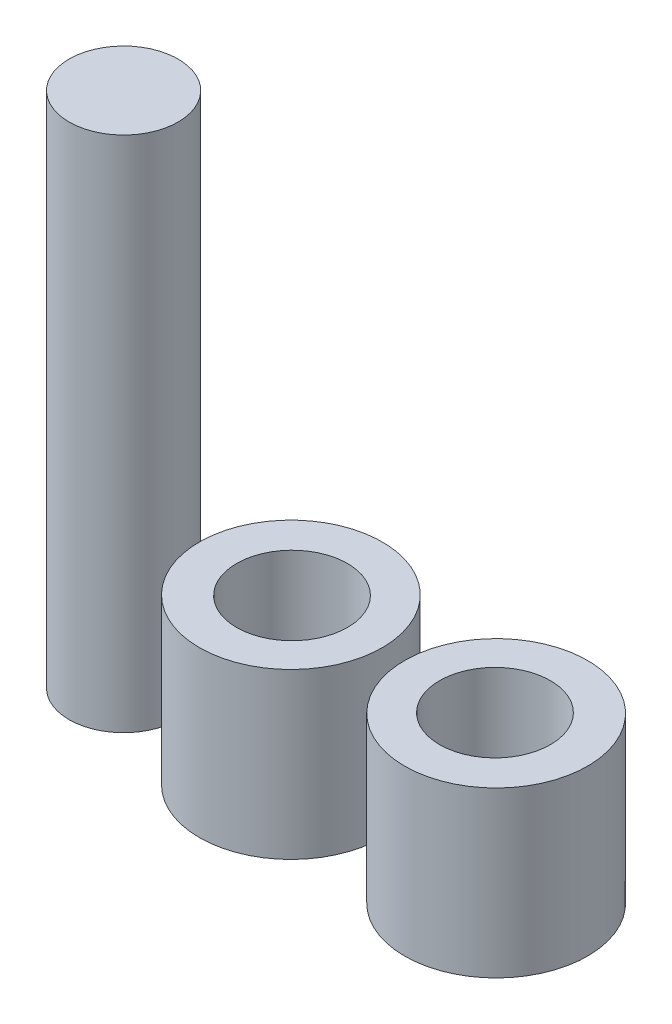
ISO-10303-21;
HEADER;
FILE_DESCRIPTION(('STEP AP214'),'2;1');
FILE_NAME('part.step','',(''),(''),'','','');
FILE_SCHEMA(('AUTOMOTIVE_DESIGN { 1 0 10303 214 1 1 1 1 }'));
ENDSEC;
DATA;
#1=APPLICATION_CONTEXT('core data for automotive mechanical design processes');
#2=APPLICATION_PROTOCOL_DEFINITION('international standard','automotive_design',2000,#1);
#3=PRODUCT_CONTEXT('',#1,'mechanical');
#4=PRODUCT('Part','Part','',(#3));
#5=PRODUCT_RELATED_PRODUCT_CATEGORY('part','',(#4));
#6=PRODUCT_DEFINITION_FORMATION('','',#4);
#7=PRODUCT_DEFINITION_CONTEXT('part definition',#1,'design');
#8=PRODUCT_DEFINITION('design','',#6,#7);
#9=PRODUCT_DEFINITION_SHAPE('','',#8);
#10=(LENGTH_UNIT() NAMED_UNIT(*) SI_UNIT(.MILLI.,.METRE.));
#11=(NAMED_UNIT(*) PLANE_ANGLE_UNIT() SI_UNIT($,.RADIAN.));
#12=(NAMED_UNIT(*) SI_UNIT($,.STERADIAN.) SOLID_ANGLE_UNIT());
#13=UNCERTAINTY_MEASURE_WITH_UNIT(LENGTH_MEASURE(1.E-05),#10,'distance_accuracy_value','');
#14=(GEOMETRIC_REPRESENTATION_CONTEXT(3) GLOBAL_UNCERTAINTY_ASSIGNED_CONTEXT((#13)) GLOBAL_UNIT_ASSIGNED_CONTEXT((#10,
#11,#12)) REPRESENTATION_CONTEXT('',''));
#15=CARTESIAN_POINT('',(0.,0.,0.));
#16=DIRECTION('',(0.,0.,1.));
#17=DIRECTION('',(1.,0.,0.));
#18=AXIS2_PLACEMENT_3D('',#15,#16,#17);
#19=CARTESIAN_POINT('',(10.0759038740106,4.45,0.));
#20=DIRECTION('',(0.,-1.,0.));
#21=DIRECTION('',(0.,0.,-1.));
#22=AXIS2_PLACEMENT_3D('',#19,#20,#21);
#23=CYLINDRICAL_SURFACE('',#22,2.475);
#24=CARTESIAN_POINT('',(10.0759038740106,4.45,0.));
#25=DIRECTION('',(0.,-1.,0.));
#26=DIRECTION('',(0.,0.,1.));
#27=AXIS2_PLACEMENT_3D('',#24,#25,#26);
#28=CIRCLE('',#27,2.475);
#29=CARTESIAN_POINT('',(10.0759038740106,4.45,2.475));
#30=VERTEX_POINT('',#29);
#31=EDGE_CURVE('E11',#30,#30,#28,.T.);
#32=ORIENTED_EDGE('',*,*,#31,.T.);
#33=EDGE_LOOP('',(#32));
#34=FACE_BOUND('',#33,.T.);
#35=CARTESIAN_POINT('',(10.0759038740106,0.,0.));
#36=DIRECTION('',(0.,-1.,0.));
#37=DIRECTION('',(0.,0.,1.));
#38=AXIS2_PLACEMENT_3D('',#35,#36,#37);
#39=CIRCLE('',#38,2.475);
#40=CARTESIAN_POINT('',(10.0759038740106,0.,2.475));
#41=VERTEX_POINT('',#40);
#42=EDGE_CURVE('E43',#41,#41,#39,.T.);
#43=ORIENTED_EDGE('',*,*,#42,.F.);
#44=EDGE_LOOP('',(#43));
#45=FACE_BOUND('',#44,.T.);
#46=ADVANCED_FACE('F40',(#34,#45),#23,.T.);
#47=CARTESIAN_POINT('',(10.0759038740106,4.45,0.));
#48=DIRECTION('',(0.,1.,0.));
#49=DIRECTION('',(0.,0.,1.));
#50=AXIS2_PLACEMENT_3D('',#47,#48,#49);
#51=PLANE('',#50);
#52=CARTESIAN_POINT('',(10.0446810340956,4.45,0.));
#53=DIRECTION('',(0.,-1.,0.));
#54=DIRECTION('',(0.,0.,1.));
#55=AXIS2_PLACEMENT_3D('',#52,#53,#54);
#56=CIRCLE('',#55,1.5);
#57=CARTESIAN_POINT('',(10.0446810340956,4.45,1.5));
#58=VERTEX_POINT('',#57);
#59=EDGE_CURVE('E52',#58,#58,#56,.T.);
#60=ORIENTED_EDGE('',*,*,#59,.T.);
#61=EDGE_LOOP('',(#60));
#62=FACE_BOUND('',#61,.T.);
#63=ORIENTED_EDGE('',*,*,#31,.F.);
#64=EDGE_LOOP('',(#63));
#65=FACE_BOUND('',#64,.T.);
#66=ADVANCED_FACE('F64',(#62,#65),#51,.T.);
#67=CARTESIAN_POINT('',(10.0759038740106,0.,0.));
#68=DIRECTION('',(0.,1.,0.));
#69=DIRECTION('',(0.,0.,1.));
#70=AXIS2_PLACEMENT_3D('',#67,#68,#69);
#71=PLANE('',#70);
#72=CARTESIAN_POINT('',(10.0446810340956,0.,0.));
#73=DIRECTION('',(0.,-1.,0.));
#74=DIRECTION('',(0.,0.,1.));
#75=AXIS2_PLACEMENT_3D('',#72,#73,#74);
#76=CIRCLE('',#75,1.5);
#77=CARTESIAN_POINT('',(10.0446810340956,0.,1.5));
#78=VERTEX_POINT('',#77);
#79=EDGE_CURVE('E50',#78,#78,#76,.T.);
#80=ORIENTED_EDGE('',*,*,#79,.F.);
#81=EDGE_LOOP('',(#80));
#82=FACE_BOUND('',#81,.T.);
#83=ORIENTED_EDGE('',*,*,#42,.T.);
#84=EDGE_LOOP('',(#83));
#85=FACE_BOUND('',#84,.T.);
#86=ADVANCED_FACE('F61',(#82,#85),#71,.F.);
#87=CARTESIAN_POINT('',(10.0446810340956,0.,0.));
#88=DIRECTION('',(0.,1.,0.));
#89=DIRECTION('',(0.,0.,1.));
#90=AXIS2_PLACEMENT_3D('',#87,#88,#89);
#91=CYLINDRICAL_SURFACE('',#90,1.5);
#92=ORIENTED_EDGE('',*,*,#79,.T.);
#93=EDGE_LOOP('',(#92));
#94=FACE_BOUND('',#93,.T.);
#95=ORIENTED_EDGE('',*,*,#59,.F.);
#96=EDGE_LOOP('',(#95));
#97=FACE_BOUND('',#96,.T.);
#98=ADVANCED_FACE('F58',(#94,#97),#91,.F.);
#99=CLOSED_SHELL('',(#46,#66,#86,#98));
#100=MANIFOLD_SOLID_BREP('B2',#99);
#101=CARTESIAN_POINT('',(4.52409612598939,4.45,0.));
#102=DIRECTION('',(0.,-1.,0.));
#103=DIRECTION('',(0.,0.,-1.));
#104=AXIS2_PLACEMENT_3D('',#101,#102,#103);
#105=CYLINDRICAL_SURFACE('',#104,2.475);
#106=CARTESIAN_POINT('',(4.52409612598939,4.45,0.));
#107=DIRECTION('',(0.,1.,0.));
#108=DIRECTION('',(0.,0.,1.));
#109=AXIS2_PLACEMENT_3D('',#106,#107,#108);
#110=CIRCLE('',#109,2.475);
#111=CARTESIAN_POINT('',(4.52409612598939,4.45,2.475));
#112=VERTEX_POINT('',#111);
#113=EDGE_CURVE('E39',#112,#112,#110,.T.);
#114=ORIENTED_EDGE('',*,*,#113,.F.);
#115=EDGE_LOOP('',(#114));
#116=FACE_BOUND('',#115,.T.);
#117=CARTESIAN_POINT('',(4.52409612598939,0.,0.));
#118=DIRECTION('',(0.,1.,0.));
#119=DIRECTION('',(0.,0.,1.));
#120=AXIS2_PLACEMENT_3D('',#117,#118,#119);
#121=CIRCLE('',#120,2.475);
#122=CARTESIAN_POINT('',(4.52409612598939,0.,2.475));
#123=VERTEX_POINT('',#122);
#124=EDGE_CURVE('E112',#123,#123,#121,.T.);
#125=ORIENTED_EDGE('',*,*,#124,.T.);
#126=EDGE_LOOP('',(#125));
#127=FACE_BOUND('',#126,.T.);
#128=ADVANCED_FACE('F109',(#116,#127),#105,.T.);
#129=CARTESIAN_POINT('',(4.52409612598939,4.45,0.));
#130=DIRECTION('',(0.,1.,0.));
#131=DIRECTION('',(0.,0.,1.));
#132=AXIS2_PLACEMENT_3D('',#129,#130,#131);
#133=PLANE('',#132);
#134=CARTESIAN_POINT('',(4.5553189659044,4.45,0.));
#135=DIRECTION('',(0.,1.,0.));
#136=DIRECTION('',(0.,0.,1.));
#137=AXIS2_PLACEMENT_3D('',#134,#135,#136);
#138=CIRCLE('',#137,1.5);
#139=CARTESIAN_POINT('',(4.5553189659044,4.45,1.5));
#140=VERTEX_POINT('',#139);
#141=EDGE_CURVE('E121',#140,#140,#138,.T.);
#142=ORIENTED_EDGE('',*,*,#141,.F.);
#143=EDGE_LOOP('',(#142));
#144=FACE_BOUND('',#143,.T.);
#145=ORIENTED_EDGE('',*,*,#113,.T.);
#146=EDGE_LOOP('',(#145));
#147=FACE_BOUND('',#146,.T.);
#148=ADVANCED_FACE('F136',(#144,#147),#133,.T.);
#149=CARTESIAN_POINT('',(4.52409612598939,0.,0.));
#150=DIRECTION('',(0.,1.,0.));
#151=DIRECTION('',(0.,0.,1.));
#152=AXIS2_PLACEMENT_3D('',#149,#150,#151);
#153=PLANE('',#152);
#154=CARTESIAN_POINT('',(4.5553189659044,0.,0.));
#155=DIRECTION('',(0.,1.,0.));
#156=DIRECTION('',(0.,0.,1.));
#157=AXIS2_PLACEMENT_3D('',#154,#155,#156);
#158=CIRCLE('',#157,1.5);
#159=CARTESIAN_POINT('',(4.5553189659044,0.,1.5));
#160=VERTEX_POINT('',#159);
#161=EDGE_CURVE('E119',#160,#160,#158,.T.);
#162=ORIENTED_EDGE('',*,*,#161,.T.);
#163=EDGE_LOOP('',(#162));
#164=FACE_BOUND('',#163,.T.);
#165=ORIENTED_EDGE('',*,*,#124,.F.);
#166=EDGE_LOOP('',(#165));
#167=FACE_BOUND('',#166,.T.);
#168=ADVANCED_FACE('F127',(#164,#167),#153,.F.);
#169=CARTESIAN_POINT('',(4.5553189659044,0.,0.));
#170=DIRECTION('',(0.,1.,0.));
#171=DIRECTION('',(0.,0.,1.));
#172=AXIS2_PLACEMENT_3D('',#169,#170,#171);
#173=CYLINDRICAL_SURFACE('',#172,1.5);
#174=ORIENTED_EDGE('',*,*,#161,.F.);
#175=EDGE_LOOP('',(#174));
#176=FACE_BOUND('',#175,.T.);
#177=ORIENTED_EDGE('',*,*,#141,.T.);
#178=EDGE_LOOP('',(#177));
#179=FACE_BOUND('',#178,.T.);
#180=ADVANCED_FACE('F130',(#176,#179),#173,.F.);
#181=CLOSED_SHELL('',(#128,#148,#168,#180));
#182=MANIFOLD_SOLID_BREP('B6',#181);
#183=CARTESIAN_POINT('',(0.,14.,0.));
#184=DIRECTION('',(0.,-1.,0.));
#185=DIRECTION('',(0.,0.,-1.));
#186=AXIS2_PLACEMENT_3D('',#183,#184,#185);
#187=CYLINDRICAL_SURFACE('',#186,1.475);
#188=CARTESIAN_POINT('',(0.,14.,0.));
#189=DIRECTION('',(0.,1.,0.));
#190=DIRECTION('',(0.,0.,1.));
#191=AXIS2_PLACEMENT_3D('',#188,#189,#190);
#192=CIRCLE('',#191,1.475);
#193=CARTESIAN_POINT('',(0.,14.,1.475));
#194=VERTEX_POINT('',#193);
#195=EDGE_CURVE('E108',#194,#194,#192,.T.);
#196=ORIENTED_EDGE('',*,*,#195,.F.);
#197=EDGE_LOOP('',(#196));
#198=FACE_BOUND('',#197,.T.);
#199=CARTESIAN_POINT('',(0.,0.,0.));
#200=DIRECTION('',(0.,1.,0.));
#201=DIRECTION('',(0.,0.,1.));
#202=AXIS2_PLACEMENT_3D('',#199,#200,#201);
#203=CIRCLE('',#202,1.475);
#204=CARTESIAN_POINT('',(0.,0.,1.475));
#205=VERTEX_POINT('',#204);
#206=EDGE_CURVE('E174',#205,#205,#203,.T.);
#207=ORIENTED_EDGE('',*,*,#206,.T.);
#208=EDGE_LOOP('',(#207));
#209=FACE_BOUND('',#208,.T.);
#210=ADVANCED_FACE('F171',(#198,#209),#187,.T.);
#211=CARTESIAN_POINT('',(0.,14.,0.));
#212=DIRECTION('',(0.,1.,0.));
#213=DIRECTION('',(0.,0.,1.));
#214=AXIS2_PLACEMENT_3D('',#211,#212,#213);
#215=PLANE('',#214);
#216=ORIENTED_EDGE('',*,*,#195,.T.);
#217=EDGE_LOOP('',(#216));
#218=FACE_BOUND('',#217,.T.);
#219=ADVANCED_FACE('F186',(#218),#215,.T.);
#220=CARTESIAN_POINT('',(0.,0.,0.));
#221=DIRECTION('',(0.,1.,0.));
#222=DIRECTION('',(0.,0.,1.));
#223=AXIS2_PLACEMENT_3D('',#220,#221,#222);
#224=PLANE('',#223);
#225=ORIENTED_EDGE('',*,*,#206,.F.);
#226=EDGE_LOOP('',(#225));
#227=FACE_BOUND('',#226,.T.);
#228=ADVANCED_FACE('F184',(#227),#224,.F.);
#229=CLOSED_SHELL('',(#210,#219,#228));
#230=MANIFOLD_SOLID_BREP('B34',#229);
#231=ADVANCED_BREP_SHAPE_REPRESENTATION('',(#18,#100,#182,#230),#14);
#232=SHAPE_DEFINITION_REPRESENTATION(#9,#231);
ENDSEC;
END-ISO-10303-21;
